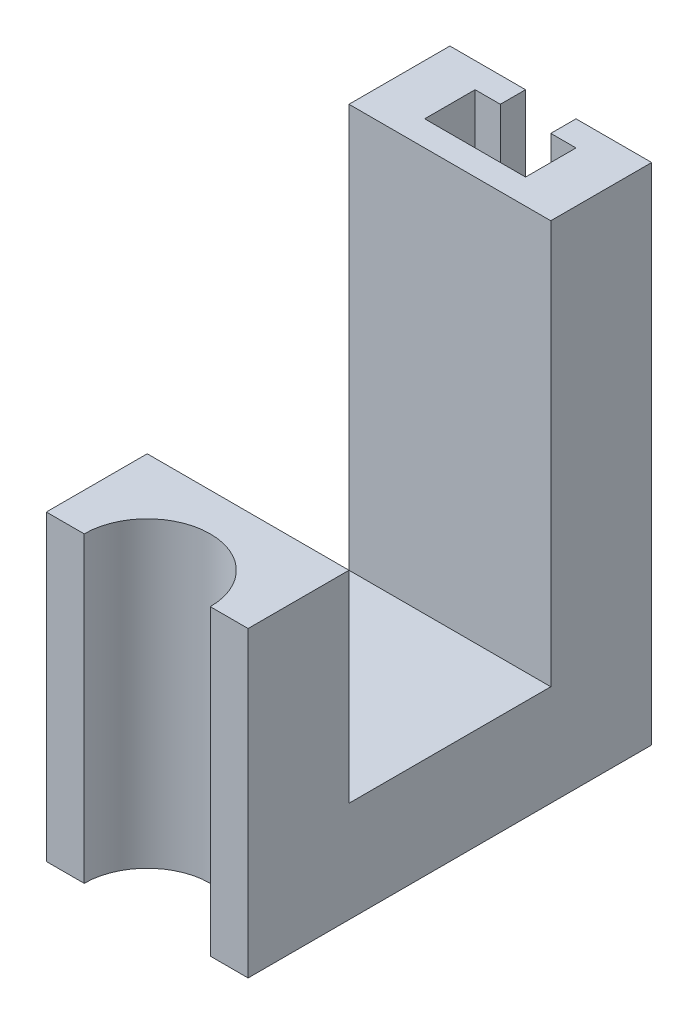
ISO-10303-21;
HEADER;
FILE_DESCRIPTION(('STEP AP214'),'2;1');
FILE_NAME('part.step','',(''),(''),'','','');
FILE_SCHEMA(('AUTOMOTIVE_DESIGN { 1 0 10303 214 1 1 1 1 }'));
ENDSEC;
DATA;
#1=APPLICATION_CONTEXT('core data for automotive mechanical design processes');
#2=APPLICATION_PROTOCOL_DEFINITION('international standard','automotive_design',2000,#1);
#3=PRODUCT_CONTEXT('',#1,'mechanical');
#4=PRODUCT('Part','Part','',(#3));
#5=PRODUCT_RELATED_PRODUCT_CATEGORY('part','',(#4));
#6=PRODUCT_DEFINITION_FORMATION('','',#4);
#7=PRODUCT_DEFINITION_CONTEXT('part definition',#1,'design');
#8=PRODUCT_DEFINITION('design','',#6,#7);
#9=PRODUCT_DEFINITION_SHAPE('','',#8);
#10=(LENGTH_UNIT() NAMED_UNIT(*) SI_UNIT(.MILLI.,.METRE.));
#11=(NAMED_UNIT(*) PLANE_ANGLE_UNIT() SI_UNIT($,.RADIAN.));
#12=(NAMED_UNIT(*) SI_UNIT($,.STERADIAN.) SOLID_ANGLE_UNIT());
#13=UNCERTAINTY_MEASURE_WITH_UNIT(LENGTH_MEASURE(1.E-05),#10,'distance_accuracy_value','');
#14=(GEOMETRIC_REPRESENTATION_CONTEXT(3) GLOBAL_UNCERTAINTY_ASSIGNED_CONTEXT((#13)) GLOBAL_UNIT_ASSIGNED_CONTEXT((#10,
#11,#12)) REPRESENTATION_CONTEXT('',''));
#15=CARTESIAN_POINT('',(0.,0.,0.));
#16=DIRECTION('',(0.,0.,1.));
#17=DIRECTION('',(1.,0.,0.));
#18=AXIS2_PLACEMENT_3D('',#15,#16,#17);
#19=CARTESIAN_POINT('',(-21.3649037691935,100.,-33.4840069835281));
#20=DIRECTION('',(0.,0.,-1.));
#21=DIRECTION('',(-1.,0.,0.));
#22=AXIS2_PLACEMENT_3D('',#19,#20,#21);
#23=PLANE('',#22);
#24=DIRECTION('',(0.,-1.,0.));
#25=VECTOR('',#24,1.);
#26=CARTESIAN_POINT('',(3.63509623080651,100.001,-33.4840069835281));
#27=LINE('',#26,#25);
#28=CARTESIAN_POINT('',(3.63509623080651,100.,-33.4840069835281));
#29=VERTEX_POINT('',#28);
#30=CARTESIAN_POINT('',(3.63509623080651,0.,-33.4840069835281));
#31=VERTEX_POINT('',#30);
#32=EDGE_CURVE('E183',#29,#31,#27,.T.);
#33=ORIENTED_EDGE('',*,*,#32,.F.);
#34=DIRECTION('',(1.,0.,0.));
#35=VECTOR('',#34,1.);
#36=CARTESIAN_POINT('',(-21.3649037691935,100.,-33.4840069835281));
#37=LINE('',#36,#35);
#38=CARTESIAN_POINT('',(18.6350962308065,100.,-33.4840069835281));
#39=VERTEX_POINT('',#38);
#40=EDGE_CURVE('E188',#29,#39,#37,.T.);
#41=ORIENTED_EDGE('',*,*,#40,.T.);
#42=DIRECTION('',(0.,-1.,0.));
#43=VECTOR('',#42,1.);
#44=CARTESIAN_POINT('',(18.6350962308065,100.,-33.4840069835281));
#45=LINE('',#44,#43);
#46=CARTESIAN_POINT('',(18.6350962308065,0.,-33.4840069835281));
#47=VERTEX_POINT('',#46);
#48=EDGE_CURVE('E48',#39,#47,#45,.T.);
#49=ORIENTED_EDGE('',*,*,#48,.T.);
#50=DIRECTION('',(1.,0.,0.));
#51=VECTOR('',#50,1.);
#52=CARTESIAN_POINT('',(-21.3649037691935,0.,-33.4840069835281));
#53=LINE('',#52,#51);
#54=EDGE_CURVE('E322',#31,#47,#53,.T.);
#55=ORIENTED_EDGE('',*,*,#54,.F.);
#56=EDGE_LOOP('',(#33,#41,#49,#55));
#57=FACE_BOUND('',#56,.T.);
#58=ADVANCED_FACE('F39',(#57),#23,.T.);
#59=CARTESIAN_POINT('',(-21.3649037691935,100.,46.5159930164719));
#60=DIRECTION('',(0.,0.,-1.));
#61=DIRECTION('',(-1.,0.,0.));
#62=AXIS2_PLACEMENT_3D('',#59,#60,#61);
#63=PLANE('',#62);
#64=DIRECTION('',(1.,0.,0.));
#65=VECTOR('',#64,1.);
#66=CARTESIAN_POINT('',(-21.3659037691935,60.,46.5159930164719));
#67=LINE('',#66,#65);
#68=CARTESIAN_POINT('',(11.1350962308065,60.,46.5159930164719));
#69=VERTEX_POINT('',#68);
#70=CARTESIAN_POINT('',(18.6350962308065,60.,46.5159930164719));
#71=VERTEX_POINT('',#70);
#72=EDGE_CURVE('E254',#69,#71,#67,.T.);
#73=ORIENTED_EDGE('',*,*,#72,.F.);
#74=DIRECTION('',(0.,-1.,0.));
#75=VECTOR('',#74,1.);
#76=CARTESIAN_POINT('',(11.1350962308065,100.001,46.5159930164719));
#77=LINE('',#76,#75);
#78=CARTESIAN_POINT('',(11.1350962308065,0.,46.5159930164719));
#79=VERTEX_POINT('',#78);
#80=EDGE_CURVE('E63',#79,#69,#77,.F.);
#81=ORIENTED_EDGE('',*,*,#80,.F.);
#82=DIRECTION('',(1.,0.,0.));
#83=VECTOR('',#82,1.);
#84=CARTESIAN_POINT('',(-21.3649037691935,0.,46.5159930164719));
#85=LINE('',#84,#83);
#86=CARTESIAN_POINT('',(18.6350962308065,0.,46.5159930164719));
#87=VERTEX_POINT('',#86);
#88=EDGE_CURVE('E299',#79,#87,#85,.T.);
#89=ORIENTED_EDGE('',*,*,#88,.T.);
#90=DIRECTION('',(0.,-1.,0.));
#91=VECTOR('',#90,1.);
#92=CARTESIAN_POINT('',(18.6350962308065,100.,46.5159930164719));
#93=LINE('',#92,#91);
#94=EDGE_CURVE('E11',#71,#87,#93,.T.);
#95=ORIENTED_EDGE('',*,*,#94,.F.);
#96=EDGE_LOOP('',(#73,#81,#89,#95));
#97=FACE_BOUND('',#96,.T.);
#98=ADVANCED_FACE('F357',(#97),#63,.F.);
#99=CARTESIAN_POINT('',(0.,100.,0.));
#100=DIRECTION('',(0.,-1.,0.));
#101=DIRECTION('',(0.,0.,-1.));
#102=AXIS2_PLACEMENT_3D('',#99,#100,#101);
#103=PLANE('',#102);
#104=ORIENTED_EDGE('',*,*,#40,.F.);
#105=DIRECTION('',(0.,0.,-1.));
#106=VECTOR('',#105,1.);
#107=CARTESIAN_POINT('',(3.63509623080651,100.,-33.4840069835281));
#108=LINE('',#107,#106);
#109=CARTESIAN_POINT('',(3.63509623080651,100.,-28.4840069835281));
#110=VERTEX_POINT('',#109);
#111=EDGE_CURVE('E166',#110,#29,#108,.T.);
#112=ORIENTED_EDGE('',*,*,#111,.F.);
#113=DIRECTION('',(-1.,0.,0.));
#114=VECTOR('',#113,1.);
#115=CARTESIAN_POINT('',(3.63509623080651,100.,-28.4840069835281));
#116=LINE('',#115,#114);
#117=CARTESIAN_POINT('',(8.63509623080651,100.,-28.4840069835281));
#118=VERTEX_POINT('',#117);
#119=EDGE_CURVE('E176',#118,#110,#116,.T.);
#120=ORIENTED_EDGE('',*,*,#119,.F.);
#121=DIRECTION('',(0.,0.,1.));
#122=VECTOR('',#121,1.);
#123=CARTESIAN_POINT('',(8.63509623080651,100.,-18.4840069835281));
#124=LINE('',#123,#122);
#125=CARTESIAN_POINT('',(8.63509623080651,100.,-18.4840069835281));
#126=VERTEX_POINT('',#125);
#127=EDGE_CURVE('E433',#118,#126,#124,.T.);
#128=ORIENTED_EDGE('',*,*,#127,.T.);
#129=DIRECTION('',(-1.,0.,0.));
#130=VECTOR('',#129,1.);
#131=CARTESIAN_POINT('',(-11.3649037691935,100.,-18.4840069835281));
#132=LINE('',#131,#130);
#133=CARTESIAN_POINT('',(-11.3649037691935,100.,-18.4840069835281));
#134=VERTEX_POINT('',#133);
#135=EDGE_CURVE('E430',#126,#134,#132,.T.);
#136=ORIENTED_EDGE('',*,*,#135,.T.);
#137=DIRECTION('',(0.,0.,1.));
#138=VECTOR('',#137,1.);
#139=CARTESIAN_POINT('',(-11.3649037691935,100.,-18.4840069835281));
#140=LINE('',#139,#138);
#141=CARTESIAN_POINT('',(-11.3649037691935,100.,-28.4840069835281));
#142=VERTEX_POINT('',#141);
#143=EDGE_CURVE('E437',#142,#134,#140,.T.);
#144=ORIENTED_EDGE('',*,*,#143,.F.);
#145=DIRECTION('',(-1.,0.,0.));
#146=VECTOR('',#145,1.);
#147=CARTESIAN_POINT('',(-11.3649037691935,100.,-28.4840069835281));
#148=LINE('',#147,#146);
#149=CARTESIAN_POINT('',(-6.36490376919349,100.,-28.4840069835281));
#150=VERTEX_POINT('',#149);
#151=EDGE_CURVE('E197',#150,#142,#148,.T.);
#152=ORIENTED_EDGE('',*,*,#151,.F.);
#153=DIRECTION('',(0.,0.,1.));
#154=VECTOR('',#153,1.);
#155=CARTESIAN_POINT('',(-6.36490376919349,100.,-28.4840069835281));
#156=LINE('',#155,#154);
#157=CARTESIAN_POINT('',(-6.36490376919349,100.,-33.4840069835281));
#158=VERTEX_POINT('',#157);
#159=EDGE_CURVE('E190',#158,#150,#156,.T.);
#160=ORIENTED_EDGE('',*,*,#159,.F.);
#161=CARTESIAN_POINT('',(-21.3649037691935,100.,-33.4840069835281));
#162=VERTEX_POINT('',#161);
#163=EDGE_CURVE('E305',#162,#158,#37,.T.);
#164=ORIENTED_EDGE('',*,*,#163,.F.);
#165=DIRECTION('',(0.,0.,1.));
#166=VECTOR('',#165,1.);
#167=CARTESIAN_POINT('',(-21.3649037691935,100.,-33.4840069835281));
#168=LINE('',#167,#166);
#169=CARTESIAN_POINT('',(-21.3649037691935,100.,-13.4840069835281));
#170=VERTEX_POINT('',#169);
#171=EDGE_CURVE('E309',#162,#170,#168,.T.);
#172=ORIENTED_EDGE('',*,*,#171,.T.);
#173=DIRECTION('',(1.,0.,0.));
#174=VECTOR('',#173,1.);
#175=CARTESIAN_POINT('',(-21.3659037691935,100.,-13.4840069835281));
#176=LINE('',#175,#174);
#177=CARTESIAN_POINT('',(18.6350962308065,100.,-13.4840069835281));
#178=VERTEX_POINT('',#177);
#179=EDGE_CURVE('E285',#170,#178,#176,.T.);
#180=ORIENTED_EDGE('',*,*,#179,.T.);
#181=DIRECTION('',(0.,0.,1.));
#182=VECTOR('',#181,1.);
#183=CARTESIAN_POINT('',(18.6350962308065,100.,-33.4840069835281));
#184=LINE('',#183,#182);
#185=EDGE_CURVE('E300',#39,#178,#184,.T.);
#186=ORIENTED_EDGE('',*,*,#185,.F.);
#187=EDGE_LOOP('',(#104,#112,#120,#128,#136,#144,#152,#160,#164,#172,#180,#186));
#188=FACE_BOUND('',#187,.T.);
#189=ADVANCED_FACE('F186',(#188),#103,.F.);
#190=CARTESIAN_POINT('',(-21.3649037691935,0.,46.5159930164719));
#191=VERTEX_POINT('',#190);
#192=CARTESIAN_POINT('',(-13.8649037691935,0.,46.5159930164719));
#193=VERTEX_POINT('',#192);
#194=EDGE_CURVE('E314',#191,#193,#85,.T.);
#195=ORIENTED_EDGE('',*,*,#194,.T.);
#196=DIRECTION('',(0.,-1.,0.));
#197=VECTOR('',#196,1.);
#198=CARTESIAN_POINT('',(-13.8649037691935,100.001,46.5159930164719));
#199=LINE('',#198,#197);
#200=CARTESIAN_POINT('',(-13.8649037691935,60.,46.5159930164719));
#201=VERTEX_POINT('',#200);
#202=EDGE_CURVE('E182',#201,#193,#199,.T.);
#203=ORIENTED_EDGE('',*,*,#202,.F.);
#204=CARTESIAN_POINT('',(-21.3649037691935,60.,46.5159930164719));
#205=VERTEX_POINT('',#204);
#206=EDGE_CURVE('E260',#205,#201,#67,.T.);
#207=ORIENTED_EDGE('',*,*,#206,.F.);
#208=DIRECTION('',(0.,-1.,0.));
#209=VECTOR('',#208,1.);
#210=CARTESIAN_POINT('',(-21.3649037691935,100.,46.5159930164719));
#211=LINE('',#210,#209);
#212=EDGE_CURVE('E313',#205,#191,#211,.T.);
#213=ORIENTED_EDGE('',*,*,#212,.T.);
#214=EDGE_LOOP('',(#195,#203,#207,#213));
#215=FACE_BOUND('',#214,.T.);
#216=ADVANCED_FACE('F41',(#215),#63,.F.);
#217=CARTESIAN_POINT('',(18.6350962308065,100.,-33.4840069835281));
#218=DIRECTION('',(1.,0.,0.));
#219=DIRECTION('',(0.,0.,-1.));
#220=AXIS2_PLACEMENT_3D('',#217,#218,#219);
#221=PLANE('',#220);
#222=DIRECTION('',(0.,0.,-1.));
#223=VECTOR('',#222,1.);
#224=CARTESIAN_POINT('',(18.6350962308065,60.,0.));
#225=LINE('',#224,#223);
#226=CARTESIAN_POINT('',(18.6350962308065,60.,26.5159930164719));
#227=VERTEX_POINT('',#226);
#228=EDGE_CURVE('E251',#71,#227,#225,.T.);
#229=ORIENTED_EDGE('',*,*,#228,.F.);
#230=ORIENTED_EDGE('',*,*,#94,.T.);
#231=DIRECTION('',(0.,0.,1.));
#232=VECTOR('',#231,1.);
#233=CARTESIAN_POINT('',(18.6350962308065,0.,-33.4840069835281));
#234=LINE('',#233,#232);
#235=EDGE_CURVE('E318',#47,#87,#234,.T.);
#236=ORIENTED_EDGE('',*,*,#235,.F.);
#237=ORIENTED_EDGE('',*,*,#48,.F.);
#238=ORIENTED_EDGE('',*,*,#185,.T.);
#239=DIRECTION('',(0.,1.,0.));
#240=VECTOR('',#239,1.);
#241=CARTESIAN_POINT('',(18.6350962308065,20.,-13.4840069835281));
#242=LINE('',#241,#240);
#243=CARTESIAN_POINT('',(18.6350962308065,20.,-13.4840069835281));
#244=VERTEX_POINT('',#243);
#245=EDGE_CURVE('E281',#244,#178,#242,.T.);
#246=ORIENTED_EDGE('',*,*,#245,.F.);
#247=DIRECTION('',(0.,0.,-1.));
#248=VECTOR('',#247,1.);
#249=CARTESIAN_POINT('',(18.6350962308065,20.,26.5159930164719));
#250=LINE('',#249,#248);
#251=CARTESIAN_POINT('',(18.6350962308065,20.,26.5159930164719));
#252=VERTEX_POINT('',#251);
#253=EDGE_CURVE('E277',#252,#244,#250,.T.);
#254=ORIENTED_EDGE('',*,*,#253,.F.);
#255=DIRECTION('',(0.,-1.,0.));
#256=VECTOR('',#255,1.);
#257=CARTESIAN_POINT('',(18.6350962308065,100.,26.5159930164719));
#258=LINE('',#257,#256);
#259=EDGE_CURVE('E274',#227,#252,#258,.T.);
#260=ORIENTED_EDGE('',*,*,#259,.F.);
#261=EDGE_LOOP('',(#229,#230,#236,#237,#238,#246,#254,#260));
#262=FACE_BOUND('',#261,.T.);
#263=ADVANCED_FACE('F342',(#262),#221,.T.);
#264=DIRECTION('',(0.,-1.,0.));
#265=VECTOR('',#264,1.);
#266=CARTESIAN_POINT('',(-6.36490376919349,100.001,-33.4840069835281));
#267=LINE('',#266,#265);
#268=CARTESIAN_POINT('',(-6.36490376919349,0.,-33.4840069835281));
#269=VERTEX_POINT('',#268);
#270=EDGE_CURVE('E223',#158,#269,#267,.T.);
#271=ORIENTED_EDGE('',*,*,#270,.T.);
#272=CARTESIAN_POINT('',(-21.3649037691935,0.,-33.4840069835281));
#273=VERTEX_POINT('',#272);
#274=EDGE_CURVE('E323',#273,#269,#53,.T.);
#275=ORIENTED_EDGE('',*,*,#274,.F.);
#276=DIRECTION('',(0.,-1.,0.));
#277=VECTOR('',#276,1.);
#278=CARTESIAN_POINT('',(-21.3649037691935,100.,-33.4840069835281));
#279=LINE('',#278,#277);
#280=EDGE_CURVE('E332',#162,#273,#279,.T.);
#281=ORIENTED_EDGE('',*,*,#280,.F.);
#282=ORIENTED_EDGE('',*,*,#163,.T.);
#283=EDGE_LOOP('',(#271,#275,#281,#282));
#284=FACE_BOUND('',#283,.T.);
#285=ADVANCED_FACE('F365',(#284),#23,.T.);
#286=CARTESIAN_POINT('',(-21.3649037691935,100.,-33.4840069835281));
#287=DIRECTION('',(1.,0.,0.));
#288=DIRECTION('',(0.,0.,-1.));
#289=AXIS2_PLACEMENT_3D('',#286,#287,#288);
#290=PLANE('',#289);
#291=ORIENTED_EDGE('',*,*,#212,.F.);
#292=DIRECTION('',(0.,0.,1.));
#293=VECTOR('',#292,1.);
#294=CARTESIAN_POINT('',(-21.3649037691935,60.,0.));
#295=LINE('',#294,#293);
#296=CARTESIAN_POINT('',(-21.3649037691935,60.,26.5159930164719));
#297=VERTEX_POINT('',#296);
#298=EDGE_CURVE('E259',#297,#205,#295,.T.);
#299=ORIENTED_EDGE('',*,*,#298,.F.);
#300=DIRECTION('',(0.,1.,0.));
#301=VECTOR('',#300,1.);
#302=CARTESIAN_POINT('',(-21.3649037691935,100.,26.5159930164719));
#303=LINE('',#302,#301);
#304=CARTESIAN_POINT('',(-21.3649037691935,20.,26.5159930164719));
#305=VERTEX_POINT('',#304);
#306=EDGE_CURVE('E289',#305,#297,#303,.T.);
#307=ORIENTED_EDGE('',*,*,#306,.F.);
#308=DIRECTION('',(0.,0.,1.));
#309=VECTOR('',#308,1.);
#310=CARTESIAN_POINT('',(-21.3649037691935,20.,26.5159930164719));
#311=LINE('',#310,#309);
#312=CARTESIAN_POINT('',(-21.3649037691935,20.,-13.4840069835281));
#313=VERTEX_POINT('',#312);
#314=EDGE_CURVE('E266',#313,#305,#311,.T.);
#315=ORIENTED_EDGE('',*,*,#314,.F.);
#316=DIRECTION('',(0.,-1.,0.));
#317=VECTOR('',#316,1.);
#318=CARTESIAN_POINT('',(-21.3649037691935,20.,-13.4840069835281));
#319=LINE('',#318,#317);
#320=EDGE_CURVE('E270',#170,#313,#319,.T.);
#321=ORIENTED_EDGE('',*,*,#320,.F.);
#322=ORIENTED_EDGE('',*,*,#171,.F.);
#323=ORIENTED_EDGE('',*,*,#280,.T.);
#324=DIRECTION('',(0.,0.,1.));
#325=VECTOR('',#324,1.);
#326=CARTESIAN_POINT('',(-21.3649037691935,0.,-33.4840069835281));
#327=LINE('',#326,#325);
#328=EDGE_CURVE('E304',#273,#191,#327,.T.);
#329=ORIENTED_EDGE('',*,*,#328,.T.);
#330=EDGE_LOOP('',(#291,#299,#307,#315,#321,#322,#323,#329));
#331=FACE_BOUND('',#330,.T.);
#332=ADVANCED_FACE('F403',(#331),#290,.F.);
#333=CARTESIAN_POINT('',(0.,0.,0.));
#334=DIRECTION('',(0.,-1.,0.));
#335=DIRECTION('',(0.,0.,-1.));
#336=AXIS2_PLACEMENT_3D('',#333,#334,#335);
#337=PLANE('',#336);
#338=DIRECTION('',(0.,0.,1.));
#339=VECTOR('',#338,1.);
#340=CARTESIAN_POINT('',(3.63509623080651,0.,-33.4840069835281));
#341=LINE('',#340,#339);
#342=CARTESIAN_POINT('',(3.63509623080651,0.,-28.4840069835281));
#343=VERTEX_POINT('',#342);
#344=EDGE_CURVE('E55',#31,#343,#341,.T.);
#345=ORIENTED_EDGE('',*,*,#344,.F.);
#346=ORIENTED_EDGE('',*,*,#54,.T.);
#347=ORIENTED_EDGE('',*,*,#235,.T.);
#348=ORIENTED_EDGE('',*,*,#88,.F.);
#349=CARTESIAN_POINT('',(-1.36490376919348,0.,46.5159930164719));
#350=DIRECTION('',(0.,-1.,0.));
#351=DIRECTION('',(0.,0.,-1.));
#352=AXIS2_PLACEMENT_3D('',#349,#350,#351);
#353=CIRCLE('',#352,12.5);
#354=EDGE_CURVE('E245',#193,#79,#353,.T.);
#355=ORIENTED_EDGE('',*,*,#354,.F.);
#356=ORIENTED_EDGE('',*,*,#194,.F.);
#357=ORIENTED_EDGE('',*,*,#328,.F.);
#358=ORIENTED_EDGE('',*,*,#274,.T.);
#359=DIRECTION('',(0.,0.,-1.));
#360=VECTOR('',#359,1.);
#361=CARTESIAN_POINT('',(-6.36490376919349,0.,-28.4840069835281));
#362=LINE('',#361,#360);
#363=CARTESIAN_POINT('',(-6.36490376919349,0.,-28.4840069835281));
#364=VERTEX_POINT('',#363);
#365=EDGE_CURVE('E173',#364,#269,#362,.T.);
#366=ORIENTED_EDGE('',*,*,#365,.F.);
#367=DIRECTION('',(1.,0.,0.));
#368=VECTOR('',#367,1.);
#369=CARTESIAN_POINT('',(-11.3649037691935,0.,-28.4840069835281));
#370=LINE('',#369,#368);
#371=CARTESIAN_POINT('',(-11.3649037691935,0.,-28.4840069835281));
#372=VERTEX_POINT('',#371);
#373=EDGE_CURVE('E215',#372,#364,#370,.T.);
#374=ORIENTED_EDGE('',*,*,#373,.F.);
#375=DIRECTION('',(0.,0.,-1.));
#376=VECTOR('',#375,1.);
#377=CARTESIAN_POINT('',(-11.3649037691935,0.,-18.4840069835281));
#378=LINE('',#377,#376);
#379=CARTESIAN_POINT('',(-11.3649037691935,0.,-18.4840069835281));
#380=VERTEX_POINT('',#379);
#381=EDGE_CURVE('E211',#380,#372,#378,.T.);
#382=ORIENTED_EDGE('',*,*,#381,.F.);
#383=DIRECTION('',(1.,0.,0.));
#384=VECTOR('',#383,1.);
#385=CARTESIAN_POINT('',(-11.3649037691935,0.,-18.4840069835281));
#386=LINE('',#385,#384);
#387=CARTESIAN_POINT('',(8.63509623080651,0.,-18.4840069835281));
#388=VERTEX_POINT('',#387);
#389=EDGE_CURVE('E207',#380,#388,#386,.T.);
#390=ORIENTED_EDGE('',*,*,#389,.T.);
#391=DIRECTION('',(0.,0.,-1.));
#392=VECTOR('',#391,1.);
#393=CARTESIAN_POINT('',(8.63509623080651,0.,-18.4840069835281));
#394=LINE('',#393,#392);
#395=CARTESIAN_POINT('',(8.63509623080651,0.,-28.4840069835281));
#396=VERTEX_POINT('',#395);
#397=EDGE_CURVE('E203',#388,#396,#394,.T.);
#398=ORIENTED_EDGE('',*,*,#397,.T.);
#399=DIRECTION('',(1.,0.,0.));
#400=VECTOR('',#399,1.);
#401=CARTESIAN_POINT('',(3.63509623080651,0.,-28.4840069835281));
#402=LINE('',#401,#400);
#403=EDGE_CURVE('E194',#343,#396,#402,.T.);
#404=ORIENTED_EDGE('',*,*,#403,.F.);
#405=EDGE_LOOP('',(#345,#346,#347,#348,#355,#356,#357,#358,#366,#374,#382,#390,#398,#404));
#406=FACE_BOUND('',#405,.T.);
#407=ADVANCED_FACE('F346',(#406),#337,.T.);
#408=CARTESIAN_POINT('',(-21.3659037691935,20.,-13.4840069835281));
#409=DIRECTION('',(0.,0.,-1.));
#410=DIRECTION('',(-1.,0.,0.));
#411=AXIS2_PLACEMENT_3D('',#408,#409,#410);
#412=PLANE('',#411);
#413=ORIENTED_EDGE('',*,*,#320,.T.);
#414=DIRECTION('',(1.,0.,0.));
#415=VECTOR('',#414,1.);
#416=CARTESIAN_POINT('',(-21.3659037691935,20.,-13.4840069835281));
#417=LINE('',#416,#415);
#418=EDGE_CURVE('E290',#313,#244,#417,.T.);
#419=ORIENTED_EDGE('',*,*,#418,.T.);
#420=ORIENTED_EDGE('',*,*,#245,.T.);
#421=ORIENTED_EDGE('',*,*,#179,.F.);
#422=EDGE_LOOP('',(#413,#419,#420,#421));
#423=FACE_BOUND('',#422,.T.);
#424=ADVANCED_FACE('F390',(#423),#412,.F.);
#425=CARTESIAN_POINT('',(-21.3659037691935,20.,26.5159930164719));
#426=DIRECTION('',(0.,-1.,0.));
#427=DIRECTION('',(0.,0.,-1.));
#428=AXIS2_PLACEMENT_3D('',#425,#426,#427);
#429=PLANE('',#428);
#430=ORIENTED_EDGE('',*,*,#314,.T.);
#431=DIRECTION('',(1.,0.,0.));
#432=VECTOR('',#431,1.);
#433=CARTESIAN_POINT('',(-21.3659037691935,20.,26.5159930164719));
#434=LINE('',#433,#432);
#435=EDGE_CURVE('E284',#305,#252,#434,.T.);
#436=ORIENTED_EDGE('',*,*,#435,.T.);
#437=ORIENTED_EDGE('',*,*,#253,.T.);
#438=ORIENTED_EDGE('',*,*,#418,.F.);
#439=EDGE_LOOP('',(#430,#436,#437,#438));
#440=FACE_BOUND('',#439,.T.);
#441=ADVANCED_FACE('F393',(#440),#429,.F.);
#442=CARTESIAN_POINT('',(-21.3659037691935,100.,26.5159930164719));
#443=DIRECTION('',(0.,0.,1.));
#444=DIRECTION('',(1.,0.,0.));
#445=AXIS2_PLACEMENT_3D('',#442,#443,#444);
#446=PLANE('',#445);
#447=ORIENTED_EDGE('',*,*,#306,.T.);
#448=DIRECTION('',(1.,0.,0.));
#449=VECTOR('',#448,1.);
#450=CARTESIAN_POINT('',(-21.3659037691935,60.,26.5159930164719));
#451=LINE('',#450,#449);
#452=EDGE_CURVE('E255',#297,#227,#451,.T.);
#453=ORIENTED_EDGE('',*,*,#452,.T.);
#454=ORIENTED_EDGE('',*,*,#259,.T.);
#455=ORIENTED_EDGE('',*,*,#435,.F.);
#456=EDGE_LOOP('',(#447,#453,#454,#455));
#457=FACE_BOUND('',#456,.T.);
#458=ADVANCED_FACE('F386',(#457),#446,.F.);
#459=CARTESIAN_POINT('',(-21.3659037691935,60.,0.));
#460=DIRECTION('',(0.,-1.,0.));
#461=DIRECTION('',(0.,0.,-1.));
#462=AXIS2_PLACEMENT_3D('',#459,#460,#461);
#463=PLANE('',#462);
#464=ORIENTED_EDGE('',*,*,#206,.T.);
#465=CARTESIAN_POINT('',(-1.36490376919348,60.,46.5159930164719));
#466=DIRECTION('',(0.,-1.,0.));
#467=DIRECTION('',(0.,0.,-1.));
#468=AXIS2_PLACEMENT_3D('',#465,#466,#467);
#469=CIRCLE('',#468,12.5);
#470=EDGE_CURVE('E248',#69,#201,#469,.F.);
#471=ORIENTED_EDGE('',*,*,#470,.F.);
#472=ORIENTED_EDGE('',*,*,#72,.T.);
#473=ORIENTED_EDGE('',*,*,#228,.T.);
#474=ORIENTED_EDGE('',*,*,#452,.F.);
#475=ORIENTED_EDGE('',*,*,#298,.T.);
#476=EDGE_LOOP('',(#464,#471,#472,#473,#474,#475));
#477=FACE_BOUND('',#476,.T.);
#478=ADVANCED_FACE('F353',(#477),#463,.F.);
#479=CARTESIAN_POINT('',(-1.36490376919348,100.001,46.5159930164719));
#480=DIRECTION('',(0.,-1.,0.));
#481=DIRECTION('',(0.,0.,-1.));
#482=AXIS2_PLACEMENT_3D('',#479,#480,#481);
#483=CYLINDRICAL_SURFACE('',#482,12.5);
#484=ORIENTED_EDGE('',*,*,#80,.T.);
#485=ORIENTED_EDGE('',*,*,#470,.T.);
#486=ORIENTED_EDGE('',*,*,#202,.T.);
#487=ORIENTED_EDGE('',*,*,#354,.T.);
#488=EDGE_LOOP('',(#484,#485,#486,#487));
#489=FACE_BOUND('',#488,.T.);
#490=ADVANCED_FACE('F377',(#489),#483,.F.);
#491=CARTESIAN_POINT('',(3.63509623080651,100.001,-33.4840069835281));
#492=DIRECTION('',(1.,0.,0.));
#493=DIRECTION('',(0.,0.,-1.));
#494=AXIS2_PLACEMENT_3D('',#491,#492,#493);
#495=PLANE('',#494);
#496=ORIENTED_EDGE('',*,*,#111,.T.);
#497=ORIENTED_EDGE('',*,*,#32,.T.);
#498=ORIENTED_EDGE('',*,*,#344,.T.);
#499=DIRECTION('',(0.,-1.,0.));
#500=VECTOR('',#499,1.);
#501=CARTESIAN_POINT('',(3.63509623080651,100.001,-28.4840069835281));
#502=LINE('',#501,#500);
#503=EDGE_CURVE('E162',#110,#343,#502,.T.);
#504=ORIENTED_EDGE('',*,*,#503,.F.);
#505=EDGE_LOOP('',(#496,#497,#498,#504));
#506=FACE_BOUND('',#505,.T.);
#507=ADVANCED_FACE('F164',(#506),#495,.F.);
#508=CARTESIAN_POINT('',(-6.36490376919349,100.001,-28.4840069835281));
#509=DIRECTION('',(-1.,0.,0.));
#510=DIRECTION('',(0.,0.,1.));
#511=AXIS2_PLACEMENT_3D('',#508,#509,#510);
#512=PLANE('',#511);
#513=ORIENTED_EDGE('',*,*,#159,.T.);
#514=DIRECTION('',(0.,-1.,0.));
#515=VECTOR('',#514,1.);
#516=CARTESIAN_POINT('',(-6.36490376919349,100.001,-28.4840069835281));
#517=LINE('',#516,#515);
#518=EDGE_CURVE('E227',#150,#364,#517,.T.);
#519=ORIENTED_EDGE('',*,*,#518,.T.);
#520=ORIENTED_EDGE('',*,*,#365,.T.);
#521=ORIENTED_EDGE('',*,*,#270,.F.);
#522=EDGE_LOOP('',(#513,#519,#520,#521));
#523=FACE_BOUND('',#522,.T.);
#524=ADVANCED_FACE('F384',(#523),#512,.F.);
#525=CARTESIAN_POINT('',(-11.3649037691935,100.001,-28.4840069835281));
#526=DIRECTION('',(0.,0.,-1.));
#527=DIRECTION('',(-1.,0.,0.));
#528=AXIS2_PLACEMENT_3D('',#525,#526,#527);
#529=PLANE('',#528);
#530=ORIENTED_EDGE('',*,*,#151,.T.);
#531=DIRECTION('',(0.,-1.,0.));
#532=VECTOR('',#531,1.);
#533=CARTESIAN_POINT('',(-11.3649037691935,100.001,-28.4840069835281));
#534=LINE('',#533,#532);
#535=EDGE_CURVE('E230',#142,#372,#534,.T.);
#536=ORIENTED_EDGE('',*,*,#535,.T.);
#537=ORIENTED_EDGE('',*,*,#373,.T.);
#538=ORIENTED_EDGE('',*,*,#518,.F.);
#539=EDGE_LOOP('',(#530,#536,#537,#538));
#540=FACE_BOUND('',#539,.T.);
#541=ADVANCED_FACE('F419',(#540),#529,.F.);
#542=CARTESIAN_POINT('',(-11.3649037691935,100.001,-18.4840069835281));
#543=DIRECTION('',(-1.,0.,0.));
#544=DIRECTION('',(0.,0.,1.));
#545=AXIS2_PLACEMENT_3D('',#542,#543,#544);
#546=PLANE('',#545);
#547=ORIENTED_EDGE('',*,*,#143,.T.);
#548=DIRECTION('',(0.,-1.,0.));
#549=VECTOR('',#548,1.);
#550=CARTESIAN_POINT('',(-11.3649037691935,100.001,-18.4840069835281));
#551=LINE('',#550,#549);
#552=EDGE_CURVE('E233',#134,#380,#551,.T.);
#553=ORIENTED_EDGE('',*,*,#552,.T.);
#554=ORIENTED_EDGE('',*,*,#381,.T.);
#555=ORIENTED_EDGE('',*,*,#535,.F.);
#556=EDGE_LOOP('',(#547,#553,#554,#555));
#557=FACE_BOUND('',#556,.T.);
#558=ADVANCED_FACE('F423',(#557),#546,.F.);
#559=CARTESIAN_POINT('',(-11.3649037691935,100.001,-18.4840069835281));
#560=DIRECTION('',(0.,0.,-1.));
#561=DIRECTION('',(-1.,0.,0.));
#562=AXIS2_PLACEMENT_3D('',#559,#560,#561);
#563=PLANE('',#562);
#564=DIRECTION('',(0.,-1.,0.));
#565=VECTOR('',#564,1.);
#566=CARTESIAN_POINT('',(8.63509623080651,100.001,-18.4840069835281));
#567=LINE('',#566,#565);
#568=EDGE_CURVE('E236',#126,#388,#567,.T.);
#569=ORIENTED_EDGE('',*,*,#568,.T.);
#570=ORIENTED_EDGE('',*,*,#389,.F.);
#571=ORIENTED_EDGE('',*,*,#552,.F.);
#572=ORIENTED_EDGE('',*,*,#135,.F.);
#573=EDGE_LOOP('',(#569,#570,#571,#572));
#574=FACE_BOUND('',#573,.T.);
#575=ADVANCED_FACE('F427',(#574),#563,.T.);
#576=CARTESIAN_POINT('',(8.63509623080651,100.001,-18.4840069835281));
#577=DIRECTION('',(-1.,0.,0.));
#578=DIRECTION('',(0.,0.,1.));
#579=AXIS2_PLACEMENT_3D('',#576,#577,#578);
#580=PLANE('',#579);
#581=DIRECTION('',(0.,-1.,0.));
#582=VECTOR('',#581,1.);
#583=CARTESIAN_POINT('',(8.63509623080651,100.001,-28.4840069835281));
#584=LINE('',#583,#582);
#585=EDGE_CURVE('E172',#118,#396,#584,.T.);
#586=ORIENTED_EDGE('',*,*,#585,.T.);
#587=ORIENTED_EDGE('',*,*,#397,.F.);
#588=ORIENTED_EDGE('',*,*,#568,.F.);
#589=ORIENTED_EDGE('',*,*,#127,.F.);
#590=EDGE_LOOP('',(#586,#587,#588,#589));
#591=FACE_BOUND('',#590,.T.);
#592=ADVANCED_FACE('F432',(#591),#580,.T.);
#593=CARTESIAN_POINT('',(3.63509623080651,100.001,-28.4840069835281));
#594=DIRECTION('',(0.,0.,-1.));
#595=DIRECTION('',(-1.,0.,0.));
#596=AXIS2_PLACEMENT_3D('',#593,#594,#595);
#597=PLANE('',#596);
#598=ORIENTED_EDGE('',*,*,#119,.T.);
#599=ORIENTED_EDGE('',*,*,#503,.T.);
#600=ORIENTED_EDGE('',*,*,#403,.T.);
#601=ORIENTED_EDGE('',*,*,#585,.F.);
#602=EDGE_LOOP('',(#598,#599,#600,#601));
#603=FACE_BOUND('',#602,.T.);
#604=ADVANCED_FACE('F177',(#603),#597,.F.);
#605=CLOSED_SHELL('',(#58,#98,#189,#216,#263,#285,#332,#407,#424,#441,#458,#478,#490,#507,#524,
#541,#558,#575,#592,#604));
#606=MANIFOLD_SOLID_BREP('B2',#605);
#607=ADVANCED_BREP_SHAPE_REPRESENTATION('',(#18,#606),#14);
#608=SHAPE_DEFINITION_REPRESENTATION(#9,#607);
ENDSEC;
END-ISO-10303-21;
